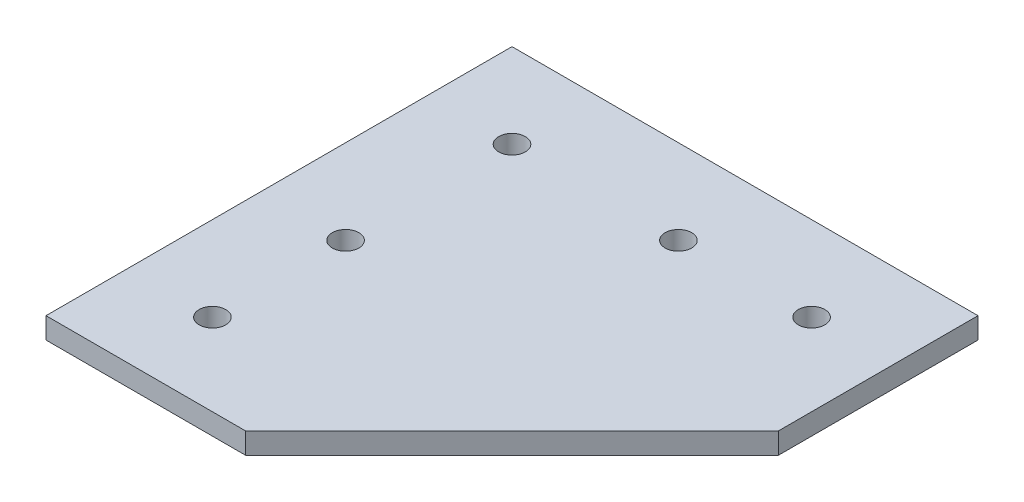
ISO-10303-21;
HEADER;
FILE_DESCRIPTION(('STEP AP214'),'2;1');
FILE_NAME('part.step','',(''),(''),'','','');
FILE_SCHEMA(('AUTOMOTIVE_DESIGN { 1 0 10303 214 1 1 1 1 }'));
ENDSEC;
DATA;
#1=APPLICATION_CONTEXT('core data for automotive mechanical design processes');
#2=APPLICATION_PROTOCOL_DEFINITION('international standard','automotive_design',2000,#1);
#3=PRODUCT_CONTEXT('',#1,'mechanical');
#4=PRODUCT('Part','Part','',(#3));
#5=PRODUCT_RELATED_PRODUCT_CATEGORY('part','',(#4));
#6=PRODUCT_DEFINITION_FORMATION('','',#4);
#7=PRODUCT_DEFINITION_CONTEXT('part definition',#1,'design');
#8=PRODUCT_DEFINITION('design','',#6,#7);
#9=PRODUCT_DEFINITION_SHAPE('','',#8);
#10=(LENGTH_UNIT() NAMED_UNIT(*) SI_UNIT(.MILLI.,.METRE.));
#11=(NAMED_UNIT(*) PLANE_ANGLE_UNIT() SI_UNIT($,.RADIAN.));
#12=(NAMED_UNIT(*) SI_UNIT($,.STERADIAN.) SOLID_ANGLE_UNIT());
#13=UNCERTAINTY_MEASURE_WITH_UNIT(LENGTH_MEASURE(1.E-05),#10,'distance_accuracy_value','');
#14=(GEOMETRIC_REPRESENTATION_CONTEXT(3) GLOBAL_UNCERTAINTY_ASSIGNED_CONTEXT((#13)) GLOBAL_UNIT_ASSIGNED_CONTEXT((#10,
#11,#12)) REPRESENTATION_CONTEXT('',''));
#15=CARTESIAN_POINT('',(0.,0.,0.));
#16=DIRECTION('',(0.,0.,1.));
#17=DIRECTION('',(1.,0.,0.));
#18=AXIS2_PLACEMENT_3D('',#15,#16,#17);
#19=CARTESIAN_POINT('',(-35.,3.175,35.));
#20=DIRECTION('',(1.,0.,0.));
#21=DIRECTION('',(0.,0.,-1.));
#22=AXIS2_PLACEMENT_3D('',#19,#20,#21);
#23=PLANE('',#22);
#24=DIRECTION('',(0.,0.,1.));
#25=VECTOR('',#24,1.);
#26=CARTESIAN_POINT('',(-35.,0.,35.));
#27=LINE('',#26,#25);
#28=CARTESIAN_POINT('',(-35.,0.,-35.));
#29=VERTEX_POINT('',#28);
#30=CARTESIAN_POINT('',(-35.,0.,35.));
#31=VERTEX_POINT('',#30);
#32=EDGE_CURVE('E126',#29,#31,#27,.T.);
#33=ORIENTED_EDGE('',*,*,#32,.T.);
#34=DIRECTION('',(0.,-1.,0.));
#35=VECTOR('',#34,1.);
#36=CARTESIAN_POINT('',(-35.,3.175,35.));
#37=LINE('',#36,#35);
#38=CARTESIAN_POINT('',(-35.,3.175,35.));
#39=VERTEX_POINT('',#38);
#40=EDGE_CURVE('E11',#39,#31,#37,.T.);
#41=ORIENTED_EDGE('',*,*,#40,.F.);
#42=DIRECTION('',(0.,0.,1.));
#43=VECTOR('',#42,1.);
#44=CARTESIAN_POINT('',(-35.,3.175,35.));
#45=LINE('',#44,#43);
#46=CARTESIAN_POINT('',(-35.,3.175,-35.));
#47=VERTEX_POINT('',#46);
#48=EDGE_CURVE('E124',#47,#39,#45,.T.);
#49=ORIENTED_EDGE('',*,*,#48,.F.);
#50=DIRECTION('',(0.,-1.,0.));
#51=VECTOR('',#50,1.);
#52=CARTESIAN_POINT('',(-35.,3.175,-35.));
#53=LINE('',#52,#51);
#54=EDGE_CURVE('E130',#47,#29,#53,.T.);
#55=ORIENTED_EDGE('',*,*,#54,.T.);
#56=EDGE_LOOP('',(#33,#41,#49,#55));
#57=FACE_BOUND('',#56,.T.);
#58=ADVANCED_FACE('F45',(#57),#23,.F.);
#59=CARTESIAN_POINT('',(35.,3.175,35.));
#60=DIRECTION('',(0.,0.,-1.));
#61=DIRECTION('',(-1.,0.,0.));
#62=AXIS2_PLACEMENT_3D('',#59,#60,#61);
#63=PLANE('',#62);
#64=DIRECTION('',(1.,0.,0.));
#65=VECTOR('',#64,1.);
#66=CARTESIAN_POINT('',(35.,0.,35.));
#67=LINE('',#66,#65);
#68=CARTESIAN_POINT('',(-5.00000000000042,0.,35.));
#69=VERTEX_POINT('',#68);
#70=EDGE_CURVE('E120',#31,#69,#67,.T.);
#71=ORIENTED_EDGE('',*,*,#70,.T.);
#72=DIRECTION('',(0.,1.,0.));
#73=VECTOR('',#72,1.);
#74=CARTESIAN_POINT('',(-5.00000000000042,0.,35.));
#75=LINE('',#74,#73);
#76=CARTESIAN_POINT('',(-5.00000000000042,3.175,35.));
#77=VERTEX_POINT('',#76);
#78=EDGE_CURVE('E60',#69,#77,#75,.T.);
#79=ORIENTED_EDGE('',*,*,#78,.T.);
#80=DIRECTION('',(1.,0.,0.));
#81=VECTOR('',#80,1.);
#82=CARTESIAN_POINT('',(35.,3.175,35.));
#83=LINE('',#82,#81);
#84=EDGE_CURVE('E91',#39,#77,#83,.T.);
#85=ORIENTED_EDGE('',*,*,#84,.F.);
#86=ORIENTED_EDGE('',*,*,#40,.T.);
#87=EDGE_LOOP('',(#71,#79,#85,#86));
#88=FACE_BOUND('',#87,.T.);
#89=ADVANCED_FACE('F161',(#88),#63,.F.);
#90=CARTESIAN_POINT('',(35.,3.175,35.));
#91=DIRECTION('',(-1.,0.,0.));
#92=DIRECTION('',(0.,0.,1.));
#93=AXIS2_PLACEMENT_3D('',#90,#91,#92);
#94=PLANE('',#93);
#95=DIRECTION('',(0.,0.,-1.));
#96=VECTOR('',#95,1.);
#97=CARTESIAN_POINT('',(35.,3.175,35.));
#98=LINE('',#97,#96);
#99=CARTESIAN_POINT('',(35.,3.175,-5.));
#100=VERTEX_POINT('',#99);
#101=CARTESIAN_POINT('',(35.,3.175,-35.));
#102=VERTEX_POINT('',#101);
#103=EDGE_CURVE('E114',#100,#102,#98,.T.);
#104=ORIENTED_EDGE('',*,*,#103,.F.);
#105=DIRECTION('',(0.,1.,0.));
#106=VECTOR('',#105,1.);
#107=CARTESIAN_POINT('',(35.,0.,-5.));
#108=LINE('',#107,#106);
#109=CARTESIAN_POINT('',(35.,0.,-5.));
#110=VERTEX_POINT('',#109);
#111=EDGE_CURVE('E101',#110,#100,#108,.T.);
#112=ORIENTED_EDGE('',*,*,#111,.F.);
#113=DIRECTION('',(0.,0.,-1.));
#114=VECTOR('',#113,1.);
#115=CARTESIAN_POINT('',(35.,0.,35.));
#116=LINE('',#115,#114);
#117=CARTESIAN_POINT('',(35.,0.,-35.));
#118=VERTEX_POINT('',#117);
#119=EDGE_CURVE('E113',#110,#118,#116,.T.);
#120=ORIENTED_EDGE('',*,*,#119,.T.);
#121=DIRECTION('',(0.,-1.,0.));
#122=VECTOR('',#121,1.);
#123=CARTESIAN_POINT('',(35.,3.175,-35.));
#124=LINE('',#123,#122);
#125=EDGE_CURVE('E53',#102,#118,#124,.T.);
#126=ORIENTED_EDGE('',*,*,#125,.F.);
#127=EDGE_LOOP('',(#104,#112,#120,#126));
#128=FACE_BOUND('',#127,.T.);
#129=ADVANCED_FACE('F111',(#128),#94,.F.);
#130=CARTESIAN_POINT('',(35.,3.175,-35.));
#131=DIRECTION('',(0.,0.,1.));
#132=DIRECTION('',(1.,0.,0.));
#133=AXIS2_PLACEMENT_3D('',#130,#131,#132);
#134=PLANE('',#133);
#135=DIRECTION('',(-1.,0.,0.));
#136=VECTOR('',#135,1.);
#137=CARTESIAN_POINT('',(35.,0.,-35.));
#138=LINE('',#137,#136);
#139=EDGE_CURVE('E86',#118,#29,#138,.T.);
#140=ORIENTED_EDGE('',*,*,#139,.T.);
#141=ORIENTED_EDGE('',*,*,#54,.F.);
#142=DIRECTION('',(-1.,0.,0.));
#143=VECTOR('',#142,1.);
#144=CARTESIAN_POINT('',(35.,3.175,-35.));
#145=LINE('',#144,#143);
#146=EDGE_CURVE('E69',#102,#47,#145,.T.);
#147=ORIENTED_EDGE('',*,*,#146,.F.);
#148=ORIENTED_EDGE('',*,*,#125,.T.);
#149=EDGE_LOOP('',(#140,#141,#147,#148));
#150=FACE_BOUND('',#149,.T.);
#151=ADVANCED_FACE('F133',(#150),#134,.F.);
#152=CARTESIAN_POINT('',(0.,3.175,0.));
#153=DIRECTION('',(0.,1.,0.));
#154=DIRECTION('',(0.,0.,1.));
#155=AXIS2_PLACEMENT_3D('',#152,#153,#154);
#156=PLANE('',#155);
#157=DIRECTION('',(-0.707106781186551,0.,0.707106781186544));
#158=VECTOR('',#157,1.);
#159=CARTESIAN_POINT('',(-5.00000000000042,3.175,35.));
#160=LINE('',#159,#158);
#161=EDGE_CURVE('E107',#100,#77,#160,.T.);
#162=ORIENTED_EDGE('',*,*,#161,.F.);
#163=ORIENTED_EDGE('',*,*,#103,.T.);
#164=ORIENTED_EDGE('',*,*,#146,.T.);
#165=ORIENTED_EDGE('',*,*,#48,.T.);
#166=ORIENTED_EDGE('',*,*,#84,.T.);
#167=EDGE_LOOP('',(#162,#163,#164,#165,#166));
#168=FACE_BOUND('',#167,.T.);
#169=CARTESIAN_POINT('',(-22.3,3.175,-22.3));
#170=DIRECTION('',(0.,1.,0.));
#171=DIRECTION('',(0.,0.,1.));
#172=AXIS2_PLACEMENT_3D('',#169,#170,#171);
#173=CIRCLE('',#172,1.99999999999999);
#174=CARTESIAN_POINT('',(-22.3,3.175,-20.3));
#175=VERTEX_POINT('',#174);
#176=EDGE_CURVE('E163',#175,#175,#173,.T.);
#177=ORIENTED_EDGE('',*,*,#176,.F.);
#178=EDGE_LOOP('',(#177));
#179=FACE_BOUND('',#178,.T.);
#180=CARTESIAN_POINT('',(22.7,3.175,-22.3));
#181=DIRECTION('',(0.,1.,0.));
#182=DIRECTION('',(0.,0.,1.));
#183=AXIS2_PLACEMENT_3D('',#180,#181,#182);
#184=CIRCLE('',#183,1.99999999999999);
#185=CARTESIAN_POINT('',(22.7,3.175,-20.3));
#186=VERTEX_POINT('',#185);
#187=EDGE_CURVE('E174',#186,#186,#184,.T.);
#188=ORIENTED_EDGE('',*,*,#187,.F.);
#189=EDGE_LOOP('',(#188));
#190=FACE_BOUND('',#189,.T.);
#191=CARTESIAN_POINT('',(2.7,3.175,-22.3));
#192=DIRECTION('',(0.,1.,0.));
#193=DIRECTION('',(0.,0.,1.));
#194=AXIS2_PLACEMENT_3D('',#191,#192,#193);
#195=CIRCLE('',#194,1.99999999999999);
#196=CARTESIAN_POINT('',(2.7,3.175,-20.3));
#197=VERTEX_POINT('',#196);
#198=EDGE_CURVE('E182',#197,#197,#195,.T.);
#199=ORIENTED_EDGE('',*,*,#198,.F.);
#200=EDGE_LOOP('',(#199));
#201=FACE_BOUND('',#200,.T.);
#202=CARTESIAN_POINT('',(-22.3,3.175,2.7));
#203=DIRECTION('',(0.,1.,0.));
#204=DIRECTION('',(0.,0.,1.));
#205=AXIS2_PLACEMENT_3D('',#202,#203,#204);
#206=CIRCLE('',#205,1.99999999999999);
#207=CARTESIAN_POINT('',(-22.3,3.175,4.69999999999999));
#208=VERTEX_POINT('',#207);
#209=EDGE_CURVE('E190',#208,#208,#206,.T.);
#210=ORIENTED_EDGE('',*,*,#209,.F.);
#211=EDGE_LOOP('',(#210));
#212=FACE_BOUND('',#211,.T.);
#213=CARTESIAN_POINT('',(-22.3,3.175,22.7));
#214=DIRECTION('',(0.,1.,0.));
#215=DIRECTION('',(0.,0.,1.));
#216=AXIS2_PLACEMENT_3D('',#213,#214,#215);
#217=CIRCLE('',#216,1.99999999999999);
#218=CARTESIAN_POINT('',(-22.3,3.175,24.7));
#219=VERTEX_POINT('',#218);
#220=EDGE_CURVE('E147',#219,#219,#217,.T.);
#221=ORIENTED_EDGE('',*,*,#220,.F.);
#222=EDGE_LOOP('',(#221));
#223=FACE_BOUND('',#222,.T.);
#224=ADVANCED_FACE('F159',(#168,#179,#190,#201,#212,#223),#156,.T.);
#225=CARTESIAN_POINT('',(0.,0.,0.));
#226=DIRECTION('',(0.,1.,0.));
#227=DIRECTION('',(0.,0.,1.));
#228=AXIS2_PLACEMENT_3D('',#225,#226,#227);
#229=PLANE('',#228);
#230=CARTESIAN_POINT('',(-22.3,0.,-22.3));
#231=DIRECTION('',(0.,1.,0.));
#232=DIRECTION('',(0.,0.,1.));
#233=AXIS2_PLACEMENT_3D('',#230,#231,#232);
#234=CIRCLE('',#233,2.);
#235=CARTESIAN_POINT('',(-22.3,0.,-20.3));
#236=VERTEX_POINT('',#235);
#237=EDGE_CURVE('E167',#236,#236,#234,.T.);
#238=ORIENTED_EDGE('',*,*,#237,.T.);
#239=EDGE_LOOP('',(#238));
#240=FACE_BOUND('',#239,.T.);
#241=CARTESIAN_POINT('',(22.7,0.,-22.3));
#242=DIRECTION('',(0.,1.,0.));
#243=DIRECTION('',(0.,0.,1.));
#244=AXIS2_PLACEMENT_3D('',#241,#242,#243);
#245=CIRCLE('',#244,2.);
#246=CARTESIAN_POINT('',(22.7,0.,-20.3));
#247=VERTEX_POINT('',#246);
#248=EDGE_CURVE('E178',#247,#247,#245,.T.);
#249=ORIENTED_EDGE('',*,*,#248,.T.);
#250=EDGE_LOOP('',(#249));
#251=FACE_BOUND('',#250,.T.);
#252=CARTESIAN_POINT('',(2.7,0.,-22.3));
#253=DIRECTION('',(0.,1.,0.));
#254=DIRECTION('',(0.,0.,1.));
#255=AXIS2_PLACEMENT_3D('',#252,#253,#254);
#256=CIRCLE('',#255,2.);
#257=CARTESIAN_POINT('',(2.7,0.,-20.3));
#258=VERTEX_POINT('',#257);
#259=EDGE_CURVE('E186',#258,#258,#256,.T.);
#260=ORIENTED_EDGE('',*,*,#259,.T.);
#261=EDGE_LOOP('',(#260));
#262=FACE_BOUND('',#261,.T.);
#263=CARTESIAN_POINT('',(-22.3,0.,2.7));
#264=DIRECTION('',(0.,1.,0.));
#265=DIRECTION('',(0.,0.,1.));
#266=AXIS2_PLACEMENT_3D('',#263,#264,#265);
#267=CIRCLE('',#266,2.);
#268=CARTESIAN_POINT('',(-22.3,0.,4.7));
#269=VERTEX_POINT('',#268);
#270=EDGE_CURVE('E153',#269,#269,#267,.T.);
#271=ORIENTED_EDGE('',*,*,#270,.T.);
#272=EDGE_LOOP('',(#271));
#273=FACE_BOUND('',#272,.T.);
#274=CARTESIAN_POINT('',(-22.3,0.,22.7));
#275=DIRECTION('',(0.,1.,0.));
#276=DIRECTION('',(0.,0.,1.));
#277=AXIS2_PLACEMENT_3D('',#274,#275,#276);
#278=CIRCLE('',#277,2.);
#279=CARTESIAN_POINT('',(-22.3,0.,24.7));
#280=VERTEX_POINT('',#279);
#281=EDGE_CURVE('E142',#280,#280,#278,.T.);
#282=ORIENTED_EDGE('',*,*,#281,.T.);
#283=EDGE_LOOP('',(#282));
#284=FACE_BOUND('',#283,.T.);
#285=ORIENTED_EDGE('',*,*,#119,.F.);
#286=DIRECTION('',(-0.707106781186551,0.,0.707106781186544));
#287=VECTOR('',#286,1.);
#288=CARTESIAN_POINT('',(-5.00000000000042,0.,35.));
#289=LINE('',#288,#287);
#290=EDGE_CURVE('E98',#110,#69,#289,.T.);
#291=ORIENTED_EDGE('',*,*,#290,.T.);
#292=ORIENTED_EDGE('',*,*,#70,.F.);
#293=ORIENTED_EDGE('',*,*,#32,.F.);
#294=ORIENTED_EDGE('',*,*,#139,.F.);
#295=EDGE_LOOP('',(#285,#291,#292,#293,#294));
#296=FACE_BOUND('',#295,.T.);
#297=ADVANCED_FACE('F117',(#240,#251,#262,#273,#284,#296),#229,.F.);
#298=CARTESIAN_POINT('',(-22.3,3.175,22.7));
#299=DIRECTION('',(0.,1.,0.));
#300=DIRECTION('',(0.,0.,1.));
#301=AXIS2_PLACEMENT_3D('',#298,#299,#300);
#302=CYLINDRICAL_SURFACE('',#301,1.99999999999999);
#303=ORIENTED_EDGE('',*,*,#281,.F.);
#304=EDGE_LOOP('',(#303));
#305=FACE_BOUND('',#304,.T.);
#306=ORIENTED_EDGE('',*,*,#220,.T.);
#307=EDGE_LOOP('',(#306));
#308=FACE_BOUND('',#307,.T.);
#309=ADVANCED_FACE('F202',(#305,#308),#302,.F.);
#310=CARTESIAN_POINT('',(-22.3,3.175,2.7));
#311=DIRECTION('',(0.,1.,0.));
#312=DIRECTION('',(0.,0.,1.));
#313=AXIS2_PLACEMENT_3D('',#310,#311,#312);
#314=CYLINDRICAL_SURFACE('',#313,1.99999999999999);
#315=ORIENTED_EDGE('',*,*,#270,.F.);
#316=EDGE_LOOP('',(#315));
#317=FACE_BOUND('',#316,.T.);
#318=ORIENTED_EDGE('',*,*,#209,.T.);
#319=EDGE_LOOP('',(#318));
#320=FACE_BOUND('',#319,.T.);
#321=ADVANCED_FACE('F198',(#317,#320),#314,.F.);
#322=CARTESIAN_POINT('',(2.7,3.175,-22.3));
#323=DIRECTION('',(0.,1.,0.));
#324=DIRECTION('',(0.,0.,1.));
#325=AXIS2_PLACEMENT_3D('',#322,#323,#324);
#326=CYLINDRICAL_SURFACE('',#325,1.99999999999999);
#327=ORIENTED_EDGE('',*,*,#259,.F.);
#328=EDGE_LOOP('',(#327));
#329=FACE_BOUND('',#328,.T.);
#330=ORIENTED_EDGE('',*,*,#198,.T.);
#331=EDGE_LOOP('',(#330));
#332=FACE_BOUND('',#331,.T.);
#333=ADVANCED_FACE('F201',(#329,#332),#326,.F.);
#334=CARTESIAN_POINT('',(22.7,3.175,-22.3));
#335=DIRECTION('',(0.,1.,0.));
#336=DIRECTION('',(0.,0.,1.));
#337=AXIS2_PLACEMENT_3D('',#334,#335,#336);
#338=CYLINDRICAL_SURFACE('',#337,1.99999999999999);
#339=ORIENTED_EDGE('',*,*,#248,.F.);
#340=EDGE_LOOP('',(#339));
#341=FACE_BOUND('',#340,.T.);
#342=ORIENTED_EDGE('',*,*,#187,.T.);
#343=EDGE_LOOP('',(#342));
#344=FACE_BOUND('',#343,.T.);
#345=ADVANCED_FACE('F269',(#341,#344),#338,.F.);
#346=CARTESIAN_POINT('',(-22.3,3.175,-22.3));
#347=DIRECTION('',(0.,1.,0.));
#348=DIRECTION('',(0.,0.,1.));
#349=AXIS2_PLACEMENT_3D('',#346,#347,#348);
#350=CYLINDRICAL_SURFACE('',#349,1.99999999999999);
#351=ORIENTED_EDGE('',*,*,#237,.F.);
#352=EDGE_LOOP('',(#351));
#353=FACE_BOUND('',#352,.T.);
#354=ORIENTED_EDGE('',*,*,#176,.T.);
#355=EDGE_LOOP('',(#354));
#356=FACE_BOUND('',#355,.T.);
#357=ADVANCED_FACE('F279',(#353,#356),#350,.F.);
#358=CARTESIAN_POINT('',(-5.00000000000042,0.,35.));
#359=DIRECTION('',(-0.707106781186544,0.,-0.707106781186551));
#360=DIRECTION('',(-0.707106781186551,0.,0.707106781186544));
#361=AXIS2_PLACEMENT_3D('',#358,#359,#360);
#362=PLANE('',#361);
#363=ORIENTED_EDGE('',*,*,#161,.T.);
#364=ORIENTED_EDGE('',*,*,#78,.F.);
#365=ORIENTED_EDGE('',*,*,#290,.F.);
#366=ORIENTED_EDGE('',*,*,#111,.T.);
#367=EDGE_LOOP('',(#363,#364,#365,#366));
#368=FACE_BOUND('',#367,.T.);
#369=ADVANCED_FACE('F100',(#368),#362,.F.);
#370=CLOSED_SHELL('',(#58,#89,#129,#151,#224,#297,#309,#321,#333,#345,#357,#369));
#371=MANIFOLD_SOLID_BREP('B2',#370);
#372=ADVANCED_BREP_SHAPE_REPRESENTATION('',(#18,#371),#14);
#373=SHAPE_DEFINITION_REPRESENTATION(#9,#372);
ENDSEC;
END-ISO-10303-21;
